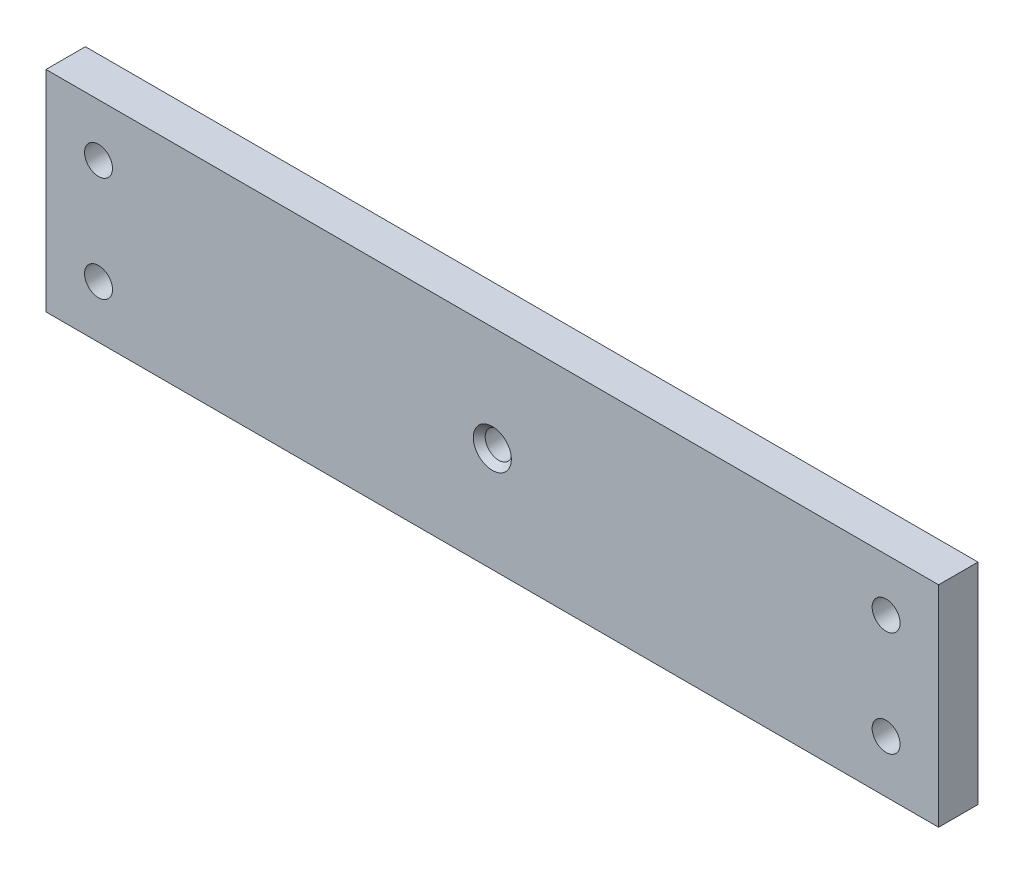
ISO-10303-21;
HEADER;
FILE_DESCRIPTION(('STEP AP214'),'2;1');
FILE_NAME('part.step','',(''),(''),'','','');
FILE_SCHEMA(('AUTOMOTIVE_DESIGN { 1 0 10303 214 1 1 1 1 }'));
ENDSEC;
DATA;
#1=APPLICATION_CONTEXT('core data for automotive mechanical design processes');
#2=APPLICATION_PROTOCOL_DEFINITION('international standard','automotive_design',2000,#1);
#3=PRODUCT_CONTEXT('',#1,'mechanical');
#4=PRODUCT('Part','Part','',(#3));
#5=PRODUCT_RELATED_PRODUCT_CATEGORY('part','',(#4));
#6=PRODUCT_DEFINITION_FORMATION('','',#4);
#7=PRODUCT_DEFINITION_CONTEXT('part definition',#1,'design');
#8=PRODUCT_DEFINITION('design','',#6,#7);
#9=PRODUCT_DEFINITION_SHAPE('','',#8);
#10=(LENGTH_UNIT() NAMED_UNIT(*) SI_UNIT(.MILLI.,.METRE.));
#11=(NAMED_UNIT(*) PLANE_ANGLE_UNIT() SI_UNIT($,.RADIAN.));
#12=(NAMED_UNIT(*) SI_UNIT($,.STERADIAN.) SOLID_ANGLE_UNIT());
#13=UNCERTAINTY_MEASURE_WITH_UNIT(LENGTH_MEASURE(1.E-05),#10,'distance_accuracy_value','');
#14=(GEOMETRIC_REPRESENTATION_CONTEXT(3) GLOBAL_UNCERTAINTY_ASSIGNED_CONTEXT((#13)) GLOBAL_UNIT_ASSIGNED_CONTEXT((#10,
#11,#12)) REPRESENTATION_CONTEXT('',''));
#15=CARTESIAN_POINT('',(0.,0.,0.));
#16=DIRECTION('',(0.,0.,1.));
#17=DIRECTION('',(1.,0.,0.));
#18=AXIS2_PLACEMENT_3D('',#15,#16,#17);
#19=CARTESIAN_POINT('',(107.95,25.4,9.525));
#20=DIRECTION('',(-1.,0.,0.));
#21=DIRECTION('',(0.,0.,1.));
#22=AXIS2_PLACEMENT_3D('',#19,#20,#21);
#23=PLANE('',#22);
#24=DIRECTION('',(0.,1.,0.));
#25=VECTOR('',#24,1.);
#26=CARTESIAN_POINT('',(107.95,25.4,0.));
#27=LINE('',#26,#25);
#28=CARTESIAN_POINT('',(107.95,-25.4,0.));
#29=VERTEX_POINT('',#28);
#30=CARTESIAN_POINT('',(107.95,25.4,0.));
#31=VERTEX_POINT('',#30);
#32=EDGE_CURVE('E97',#29,#31,#27,.T.);
#33=ORIENTED_EDGE('',*,*,#32,.T.);
#34=DIRECTION('',(0.,0.,-1.));
#35=VECTOR('',#34,1.);
#36=CARTESIAN_POINT('',(107.95,25.4,9.525));
#37=LINE('',#36,#35);
#38=CARTESIAN_POINT('',(107.95,25.4,9.525));
#39=VERTEX_POINT('',#38);
#40=EDGE_CURVE('E11',#39,#31,#37,.T.);
#41=ORIENTED_EDGE('',*,*,#40,.F.);
#42=DIRECTION('',(0.,1.,0.));
#43=VECTOR('',#42,1.);
#44=CARTESIAN_POINT('',(107.95,25.4,9.525));
#45=LINE('',#44,#43);
#46=CARTESIAN_POINT('',(107.95,-25.4,9.525));
#47=VERTEX_POINT('',#46);
#48=EDGE_CURVE('E85',#47,#39,#45,.T.);
#49=ORIENTED_EDGE('',*,*,#48,.F.);
#50=DIRECTION('',(0.,0.,-1.));
#51=VECTOR('',#50,1.);
#52=CARTESIAN_POINT('',(107.95,-25.4,9.525));
#53=LINE('',#52,#51);
#54=EDGE_CURVE('E93',#47,#29,#53,.T.);
#55=ORIENTED_EDGE('',*,*,#54,.T.);
#56=EDGE_LOOP('',(#33,#41,#49,#55));
#57=FACE_BOUND('',#56,.T.);
#58=ADVANCED_FACE('F34',(#57),#23,.F.);
#59=CARTESIAN_POINT('',(-107.95,25.4,9.525));
#60=DIRECTION('',(0.,-1.,0.));
#61=DIRECTION('',(0.,0.,-1.));
#62=AXIS2_PLACEMENT_3D('',#59,#60,#61);
#63=PLANE('',#62);
#64=DIRECTION('',(-1.,0.,0.));
#65=VECTOR('',#64,1.);
#66=CARTESIAN_POINT('',(-107.95,25.4,0.));
#67=LINE('',#66,#65);
#68=CARTESIAN_POINT('',(-107.95,25.4,0.));
#69=VERTEX_POINT('',#68);
#70=EDGE_CURVE('E89',#31,#69,#67,.T.);
#71=ORIENTED_EDGE('',*,*,#70,.T.);
#72=DIRECTION('',(0.,0.,-1.));
#73=VECTOR('',#72,1.);
#74=CARTESIAN_POINT('',(-107.95,25.4,9.525));
#75=LINE('',#74,#73);
#76=CARTESIAN_POINT('',(-107.95,25.4,9.525));
#77=VERTEX_POINT('',#76);
#78=EDGE_CURVE('E42',#77,#69,#75,.T.);
#79=ORIENTED_EDGE('',*,*,#78,.F.);
#80=DIRECTION('',(-1.,0.,0.));
#81=VECTOR('',#80,1.);
#82=CARTESIAN_POINT('',(-107.95,25.4,9.525));
#83=LINE('',#82,#81);
#84=EDGE_CURVE('E80',#39,#77,#83,.T.);
#85=ORIENTED_EDGE('',*,*,#84,.F.);
#86=ORIENTED_EDGE('',*,*,#40,.T.);
#87=EDGE_LOOP('',(#71,#79,#85,#86));
#88=FACE_BOUND('',#87,.T.);
#89=ADVANCED_FACE('F88',(#88),#63,.F.);
#90=CARTESIAN_POINT('',(-107.95,25.4,9.525));
#91=DIRECTION('',(1.,0.,0.));
#92=DIRECTION('',(0.,0.,-1.));
#93=AXIS2_PLACEMENT_3D('',#90,#91,#92);
#94=PLANE('',#93);
#95=DIRECTION('',(0.,-1.,0.));
#96=VECTOR('',#95,1.);
#97=CARTESIAN_POINT('',(-107.95,25.4,0.));
#98=LINE('',#97,#96);
#99=CARTESIAN_POINT('',(-107.95,-25.4,0.));
#100=VERTEX_POINT('',#99);
#101=EDGE_CURVE('E67',#69,#100,#98,.T.);
#102=ORIENTED_EDGE('',*,*,#101,.T.);
#103=DIRECTION('',(0.,0.,-1.));
#104=VECTOR('',#103,1.);
#105=CARTESIAN_POINT('',(-107.95,-25.4,9.525));
#106=LINE('',#105,#104);
#107=CARTESIAN_POINT('',(-107.95,-25.4,9.525));
#108=VERTEX_POINT('',#107);
#109=EDGE_CURVE('E90',#108,#100,#106,.T.);
#110=ORIENTED_EDGE('',*,*,#109,.F.);
#111=DIRECTION('',(0.,-1.,0.));
#112=VECTOR('',#111,1.);
#113=CARTESIAN_POINT('',(-107.95,25.4,9.525));
#114=LINE('',#113,#112);
#115=EDGE_CURVE('E83',#77,#108,#114,.T.);
#116=ORIENTED_EDGE('',*,*,#115,.F.);
#117=ORIENTED_EDGE('',*,*,#78,.T.);
#118=EDGE_LOOP('',(#102,#110,#116,#117));
#119=FACE_BOUND('',#118,.T.);
#120=ADVANCED_FACE('F91',(#119),#94,.F.);
#121=CARTESIAN_POINT('',(-107.95,-25.4,9.525));
#122=DIRECTION('',(0.,1.,0.));
#123=DIRECTION('',(0.,0.,1.));
#124=AXIS2_PLACEMENT_3D('',#121,#122,#123);
#125=PLANE('',#124);
#126=DIRECTION('',(1.,0.,0.));
#127=VECTOR('',#126,1.);
#128=CARTESIAN_POINT('',(-107.95,-25.4,0.));
#129=LINE('',#128,#127);
#130=EDGE_CURVE('E73',#100,#29,#129,.T.);
#131=ORIENTED_EDGE('',*,*,#130,.T.);
#132=ORIENTED_EDGE('',*,*,#54,.F.);
#133=DIRECTION('',(1.,0.,0.));
#134=VECTOR('',#133,1.);
#135=CARTESIAN_POINT('',(-107.95,-25.4,9.525));
#136=LINE('',#135,#134);
#137=EDGE_CURVE('E50',#108,#47,#136,.T.);
#138=ORIENTED_EDGE('',*,*,#137,.F.);
#139=ORIENTED_EDGE('',*,*,#109,.T.);
#140=EDGE_LOOP('',(#131,#132,#138,#139));
#141=FACE_BOUND('',#140,.T.);
#142=ADVANCED_FACE('F105',(#141),#125,.F.);
#143=CARTESIAN_POINT('',(0.,0.,9.525));
#144=DIRECTION('',(0.,0.,1.));
#145=DIRECTION('',(1.,0.,0.));
#146=AXIS2_PLACEMENT_3D('',#143,#144,#145);
#147=PLANE('',#146);
#148=CARTESIAN_POINT('',(0.,0.,9.525));
#149=DIRECTION('',(0.,0.,1.));
#150=DIRECTION('',(1.,0.,0.));
#151=AXIS2_PLACEMENT_3D('',#148,#149,#150);
#152=CIRCLE('',#151,4.60375);
#153=CARTESIAN_POINT('',(4.60375,0.,9.525));
#154=VERTEX_POINT('',#153);
#155=EDGE_CURVE('E152',#154,#154,#152,.T.);
#156=ORIENTED_EDGE('',*,*,#155,.F.);
#157=EDGE_LOOP('',(#156));
#158=FACE_BOUND('',#157,.T.);
#159=CARTESIAN_POINT('',(95.25,12.7,9.525));
#160=DIRECTION('',(0.,0.,-1.));
#161=DIRECTION('',(-1.,0.,0.));
#162=AXIS2_PLACEMENT_3D('',#159,#160,#161);
#163=CIRCLE('',#162,3.3782);
#164=CARTESIAN_POINT('',(91.8718,12.7,9.525));
#165=VERTEX_POINT('',#164);
#166=EDGE_CURVE('E137',#165,#165,#163,.T.);
#167=ORIENTED_EDGE('',*,*,#166,.T.);
#168=EDGE_LOOP('',(#167));
#169=FACE_BOUND('',#168,.T.);
#170=CARTESIAN_POINT('',(95.25,-12.7,9.525));
#171=DIRECTION('',(0.,0.,-1.));
#172=DIRECTION('',(-1.,0.,0.));
#173=AXIS2_PLACEMENT_3D('',#170,#171,#172);
#174=CIRCLE('',#173,3.3782);
#175=CARTESIAN_POINT('',(91.8718,-12.7,9.525));
#176=VERTEX_POINT('',#175);
#177=EDGE_CURVE('E128',#176,#176,#174,.T.);
#178=ORIENTED_EDGE('',*,*,#177,.T.);
#179=EDGE_LOOP('',(#178));
#180=FACE_BOUND('',#179,.T.);
#181=CARTESIAN_POINT('',(-95.25,12.7,9.525));
#182=DIRECTION('',(0.,0.,-1.));
#183=DIRECTION('',(-1.,0.,0.));
#184=AXIS2_PLACEMENT_3D('',#181,#182,#183);
#185=CIRCLE('',#184,3.3782);
#186=CARTESIAN_POINT('',(-98.6282,12.7,9.525));
#187=VERTEX_POINT('',#186);
#188=EDGE_CURVE('E119',#187,#187,#185,.T.);
#189=ORIENTED_EDGE('',*,*,#188,.T.);
#190=EDGE_LOOP('',(#189));
#191=FACE_BOUND('',#190,.T.);
#192=CARTESIAN_POINT('',(-95.25,-12.7,9.525));
#193=DIRECTION('',(0.,0.,-1.));
#194=DIRECTION('',(-1.,0.,0.));
#195=AXIS2_PLACEMENT_3D('',#192,#193,#194);
#196=CIRCLE('',#195,3.3782);
#197=CARTESIAN_POINT('',(-98.6282,-12.7,9.525));
#198=VERTEX_POINT('',#197);
#199=EDGE_CURVE('E100',#198,#198,#196,.T.);
#200=ORIENTED_EDGE('',*,*,#199,.T.);
#201=EDGE_LOOP('',(#200));
#202=FACE_BOUND('',#201,.T.);
#203=ORIENTED_EDGE('',*,*,#48,.T.);
#204=ORIENTED_EDGE('',*,*,#84,.T.);
#205=ORIENTED_EDGE('',*,*,#115,.T.);
#206=ORIENTED_EDGE('',*,*,#137,.T.);
#207=EDGE_LOOP('',(#203,#204,#205,#206));
#208=FACE_BOUND('',#207,.T.);
#209=ADVANCED_FACE('F81',(#158,#169,#180,#191,#202,#208),#147,.T.);
#210=CARTESIAN_POINT('',(0.,0.,0.));
#211=DIRECTION('',(0.,0.,1.));
#212=DIRECTION('',(1.,0.,0.));
#213=AXIS2_PLACEMENT_3D('',#210,#211,#212);
#214=PLANE('',#213);
#215=CARTESIAN_POINT('',(0.,0.,0.));
#216=DIRECTION('',(0.,0.,1.));
#217=DIRECTION('',(1.,0.,0.));
#218=AXIS2_PLACEMENT_3D('',#215,#216,#217);
#219=CIRCLE('',#218,3.2639);
#220=CARTESIAN_POINT('',(3.2639,0.,0.));
#221=VERTEX_POINT('',#220);
#222=EDGE_CURVE('E146',#221,#221,#219,.T.);
#223=ORIENTED_EDGE('',*,*,#222,.T.);
#224=EDGE_LOOP('',(#223));
#225=FACE_BOUND('',#224,.T.);
#226=CARTESIAN_POINT('',(95.25,12.7,0.));
#227=DIRECTION('',(0.,0.,-1.));
#228=DIRECTION('',(-1.,0.,0.));
#229=AXIS2_PLACEMENT_3D('',#226,#227,#228);
#230=CIRCLE('',#229,6.4389);
#231=CARTESIAN_POINT('',(88.8111,12.7,0.));
#232=VERTEX_POINT('',#231);
#233=EDGE_CURVE('E143',#232,#232,#230,.T.);
#234=ORIENTED_EDGE('',*,*,#233,.F.);
#235=EDGE_LOOP('',(#234));
#236=FACE_BOUND('',#235,.T.);
#237=CARTESIAN_POINT('',(95.25,-12.7,0.));
#238=DIRECTION('',(0.,0.,-1.));
#239=DIRECTION('',(-1.,0.,0.));
#240=AXIS2_PLACEMENT_3D('',#237,#238,#239);
#241=CIRCLE('',#240,6.4389);
#242=CARTESIAN_POINT('',(88.8111,-12.7,0.));
#243=VERTEX_POINT('',#242);
#244=EDGE_CURVE('E134',#243,#243,#241,.T.);
#245=ORIENTED_EDGE('',*,*,#244,.F.);
#246=EDGE_LOOP('',(#245));
#247=FACE_BOUND('',#246,.T.);
#248=CARTESIAN_POINT('',(-95.25,12.7,0.));
#249=DIRECTION('',(0.,0.,-1.));
#250=DIRECTION('',(-1.,0.,0.));
#251=AXIS2_PLACEMENT_3D('',#248,#249,#250);
#252=CIRCLE('',#251,6.4389);
#253=CARTESIAN_POINT('',(-101.6889,12.7,0.));
#254=VERTEX_POINT('',#253);
#255=EDGE_CURVE('E125',#254,#254,#252,.T.);
#256=ORIENTED_EDGE('',*,*,#255,.F.);
#257=EDGE_LOOP('',(#256));
#258=FACE_BOUND('',#257,.T.);
#259=CARTESIAN_POINT('',(-95.25,-12.7,0.));
#260=DIRECTION('',(0.,0.,-1.));
#261=DIRECTION('',(-1.,0.,0.));
#262=AXIS2_PLACEMENT_3D('',#259,#260,#261);
#263=CIRCLE('',#262,6.4389);
#264=CARTESIAN_POINT('',(-101.6889,-12.7,0.));
#265=VERTEX_POINT('',#264);
#266=EDGE_CURVE('E116',#265,#265,#263,.T.);
#267=ORIENTED_EDGE('',*,*,#266,.F.);
#268=EDGE_LOOP('',(#267));
#269=FACE_BOUND('',#268,.T.);
#270=ORIENTED_EDGE('',*,*,#32,.F.);
#271=ORIENTED_EDGE('',*,*,#130,.F.);
#272=ORIENTED_EDGE('',*,*,#101,.F.);
#273=ORIENTED_EDGE('',*,*,#70,.F.);
#274=EDGE_LOOP('',(#270,#271,#272,#273));
#275=FACE_BOUND('',#274,.T.);
#276=ADVANCED_FACE('F108',(#225,#236,#247,#258,#269,#275),#214,.F.);
#277=CARTESIAN_POINT('',(-95.25,-12.7,0.));
#278=DIRECTION('',(0.,0.,-1.));
#279=DIRECTION('',(-1.,0.,0.));
#280=AXIS2_PLACEMENT_3D('',#277,#278,#279);
#281=CYLINDRICAL_SURFACE('',#280,3.3782);
#282=ORIENTED_EDGE('',*,*,#199,.F.);
#283=EDGE_LOOP('',(#282));
#284=FACE_BOUND('',#283,.T.);
#285=CARTESIAN_POINT('',(-95.25,-12.7,3.52093258398135));
#286=DIRECTION('',(0.,0.,-1.));
#287=DIRECTION('',(-1.,0.,0.));
#288=AXIS2_PLACEMENT_3D('',#285,#286,#287);
#289=CIRCLE('',#288,3.3782);
#290=CARTESIAN_POINT('',(-98.6282,-12.7,3.52093258398135));
#291=VERTEX_POINT('',#290);
#292=EDGE_CURVE('E113',#291,#291,#289,.T.);
#293=ORIENTED_EDGE('',*,*,#292,.T.);
#294=EDGE_LOOP('',(#293));
#295=FACE_BOUND('',#294,.T.);
#296=ADVANCED_FACE('F169',(#284,#295),#281,.F.);
#297=CARTESIAN_POINT('',(-95.25,-12.7,0.));
#298=DIRECTION('',(0.,0.,-1.));
#299=DIRECTION('',(-1.,0.,0.));
#300=AXIS2_PLACEMENT_3D('',#297,#298,#299);
#301=CONICAL_SURFACE('',#300,6.4389,0.715584993317675);
#302=ORIENTED_EDGE('',*,*,#292,.F.);
#303=EDGE_LOOP('',(#302));
#304=FACE_BOUND('',#303,.T.);
#305=ORIENTED_EDGE('',*,*,#266,.T.);
#306=EDGE_LOOP('',(#305));
#307=FACE_BOUND('',#306,.T.);
#308=ADVANCED_FACE('F172',(#304,#307),#301,.F.);
#309=CARTESIAN_POINT('',(-95.25,12.7,0.));
#310=DIRECTION('',(0.,0.,-1.));
#311=DIRECTION('',(-1.,0.,0.));
#312=AXIS2_PLACEMENT_3D('',#309,#310,#311);
#313=CYLINDRICAL_SURFACE('',#312,3.3782);
#314=ORIENTED_EDGE('',*,*,#188,.F.);
#315=EDGE_LOOP('',(#314));
#316=FACE_BOUND('',#315,.T.);
#317=CARTESIAN_POINT('',(-95.25,12.7,3.52093258398135));
#318=DIRECTION('',(0.,0.,-1.));
#319=DIRECTION('',(-1.,0.,0.));
#320=AXIS2_PLACEMENT_3D('',#317,#318,#319);
#321=CIRCLE('',#320,3.3782);
#322=CARTESIAN_POINT('',(-98.6282,12.7,3.52093258398135));
#323=VERTEX_POINT('',#322);
#324=EDGE_CURVE('E122',#323,#323,#321,.T.);
#325=ORIENTED_EDGE('',*,*,#324,.T.);
#326=EDGE_LOOP('',(#325));
#327=FACE_BOUND('',#326,.T.);
#328=ADVANCED_FACE('F178',(#316,#327),#313,.F.);
#329=CARTESIAN_POINT('',(-95.25,12.7,0.));
#330=DIRECTION('',(0.,0.,-1.));
#331=DIRECTION('',(-1.,0.,0.));
#332=AXIS2_PLACEMENT_3D('',#329,#330,#331);
#333=CONICAL_SURFACE('',#332,6.4389,0.715584993317675);
#334=ORIENTED_EDGE('',*,*,#324,.F.);
#335=EDGE_LOOP('',(#334));
#336=FACE_BOUND('',#335,.T.);
#337=ORIENTED_EDGE('',*,*,#255,.T.);
#338=EDGE_LOOP('',(#337));
#339=FACE_BOUND('',#338,.T.);
#340=ADVANCED_FACE('F266',(#336,#339),#333,.F.);
#341=CARTESIAN_POINT('',(95.25,-12.7,0.));
#342=DIRECTION('',(0.,0.,-1.));
#343=DIRECTION('',(-1.,0.,0.));
#344=AXIS2_PLACEMENT_3D('',#341,#342,#343);
#345=CYLINDRICAL_SURFACE('',#344,3.3782);
#346=ORIENTED_EDGE('',*,*,#177,.F.);
#347=EDGE_LOOP('',(#346));
#348=FACE_BOUND('',#347,.T.);
#349=CARTESIAN_POINT('',(95.25,-12.7,3.52093258398135));
#350=DIRECTION('',(0.,0.,-1.));
#351=DIRECTION('',(-1.,0.,0.));
#352=AXIS2_PLACEMENT_3D('',#349,#350,#351);
#353=CIRCLE('',#352,3.3782);
#354=CARTESIAN_POINT('',(91.8718,-12.7,3.52093258398135));
#355=VERTEX_POINT('',#354);
#356=EDGE_CURVE('E131',#355,#355,#353,.T.);
#357=ORIENTED_EDGE('',*,*,#356,.T.);
#358=EDGE_LOOP('',(#357));
#359=FACE_BOUND('',#358,.T.);
#360=ADVANCED_FACE('F258',(#348,#359),#345,.F.);
#361=CARTESIAN_POINT('',(95.25,-12.7,0.));
#362=DIRECTION('',(0.,0.,-1.));
#363=DIRECTION('',(-1.,0.,0.));
#364=AXIS2_PLACEMENT_3D('',#361,#362,#363);
#365=CONICAL_SURFACE('',#364,6.4389,0.715584993317675);
#366=ORIENTED_EDGE('',*,*,#356,.F.);
#367=EDGE_LOOP('',(#366));
#368=FACE_BOUND('',#367,.T.);
#369=ORIENTED_EDGE('',*,*,#244,.T.);
#370=EDGE_LOOP('',(#369));
#371=FACE_BOUND('',#370,.T.);
#372=ADVANCED_FACE('F250',(#368,#371),#365,.F.);
#373=CARTESIAN_POINT('',(95.25,12.7,0.));
#374=DIRECTION('',(0.,0.,-1.));
#375=DIRECTION('',(-1.,0.,0.));
#376=AXIS2_PLACEMENT_3D('',#373,#374,#375);
#377=CYLINDRICAL_SURFACE('',#376,3.3782);
#378=ORIENTED_EDGE('',*,*,#166,.F.);
#379=EDGE_LOOP('',(#378));
#380=FACE_BOUND('',#379,.T.);
#381=CARTESIAN_POINT('',(95.25,12.7,3.52093258398135));
#382=DIRECTION('',(0.,0.,-1.));
#383=DIRECTION('',(-1.,0.,0.));
#384=AXIS2_PLACEMENT_3D('',#381,#382,#383);
#385=CIRCLE('',#384,3.3782);
#386=CARTESIAN_POINT('',(91.8718,12.7,3.52093258398135));
#387=VERTEX_POINT('',#386);
#388=EDGE_CURVE('E140',#387,#387,#385,.T.);
#389=ORIENTED_EDGE('',*,*,#388,.T.);
#390=EDGE_LOOP('',(#389));
#391=FACE_BOUND('',#390,.T.);
#392=ADVANCED_FACE('F245',(#380,#391),#377,.F.);
#393=CARTESIAN_POINT('',(95.25,12.7,0.));
#394=DIRECTION('',(0.,0.,-1.));
#395=DIRECTION('',(-1.,0.,0.));
#396=AXIS2_PLACEMENT_3D('',#393,#394,#395);
#397=CONICAL_SURFACE('',#396,6.4389,0.715584993317675);
#398=ORIENTED_EDGE('',*,*,#388,.F.);
#399=EDGE_LOOP('',(#398));
#400=FACE_BOUND('',#399,.T.);
#401=ORIENTED_EDGE('',*,*,#233,.T.);
#402=EDGE_LOOP('',(#401));
#403=FACE_BOUND('',#402,.T.);
#404=ADVANCED_FACE('F213',(#400,#403),#397,.F.);
#405=CARTESIAN_POINT('',(0.,0.,9.525));
#406=DIRECTION('',(0.,0.,1.));
#407=DIRECTION('',(1.,0.,0.));
#408=AXIS2_PLACEMENT_3D('',#405,#406,#407);
#409=CYLINDRICAL_SURFACE('',#408,3.2639);
#410=ORIENTED_EDGE('',*,*,#222,.F.);
#411=EDGE_LOOP('',(#410));
#412=FACE_BOUND('',#411,.T.);
#413=CARTESIAN_POINT('',(0.,0.,7.98367888958493));
#414=DIRECTION('',(0.,0.,1.));
#415=DIRECTION('',(1.,0.,0.));
#416=AXIS2_PLACEMENT_3D('',#413,#414,#415);
#417=CIRCLE('',#416,3.2639);
#418=CARTESIAN_POINT('',(3.2639,0.,7.98367888958493));
#419=VERTEX_POINT('',#418);
#420=EDGE_CURVE('E149',#419,#419,#417,.T.);
#421=ORIENTED_EDGE('',*,*,#420,.T.);
#422=EDGE_LOOP('',(#421));
#423=FACE_BOUND('',#422,.T.);
#424=ADVANCED_FACE('F223',(#412,#423),#409,.F.);
#425=CARTESIAN_POINT('',(0.,0.,9.525));
#426=DIRECTION('',(0.,0.,1.));
#427=DIRECTION('',(1.,0.,0.));
#428=AXIS2_PLACEMENT_3D('',#425,#426,#427);
#429=CONICAL_SURFACE('',#428,4.60375,0.715584993317675);
#430=ORIENTED_EDGE('',*,*,#420,.F.);
#431=EDGE_LOOP('',(#430));
#432=FACE_BOUND('',#431,.T.);
#433=ORIENTED_EDGE('',*,*,#155,.T.);
#434=EDGE_LOOP('',(#433));
#435=FACE_BOUND('',#434,.T.);
#436=ADVANCED_FACE('F156',(#432,#435),#429,.F.);
#437=CLOSED_SHELL('',(#58,#89,#120,#142,#209,#276,#296,#308,#328,#340,#360,#372,#392,#404,#424,#436));
#438=MANIFOLD_SOLID_BREP('B2',#437);
#439=ADVANCED_BREP_SHAPE_REPRESENTATION('',(#18,#438),#14);
#440=SHAPE_DEFINITION_REPRESENTATION(#9,#439);
ENDSEC;
END-ISO-10303-21;
